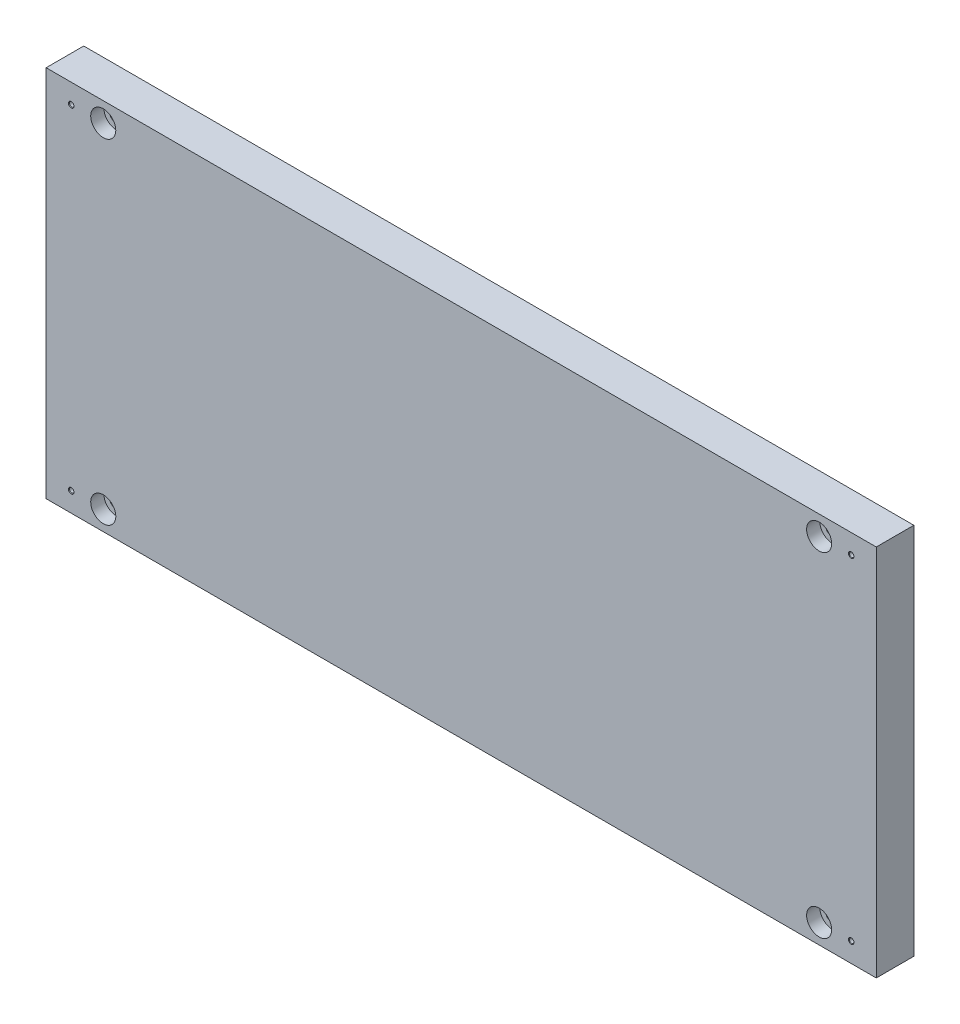
ISO-10303-21;
HEADER;
FILE_DESCRIPTION(('STEP AP214'),'2;1');
FILE_NAME('part.step','',(''),(''),'','','');
FILE_SCHEMA(('AUTOMOTIVE_DESIGN { 1 0 10303 214 1 1 1 1 }'));
ENDSEC;
DATA;
#1=APPLICATION_CONTEXT('core data for automotive mechanical design processes');
#2=APPLICATION_PROTOCOL_DEFINITION('international standard','automotive_design',2000,#1);
#3=PRODUCT_CONTEXT('',#1,'mechanical');
#4=PRODUCT('Part','Part','',(#3));
#5=PRODUCT_RELATED_PRODUCT_CATEGORY('part','',(#4));
#6=PRODUCT_DEFINITION_FORMATION('','',#4);
#7=PRODUCT_DEFINITION_CONTEXT('part definition',#1,'design');
#8=PRODUCT_DEFINITION('design','',#6,#7);
#9=PRODUCT_DEFINITION_SHAPE('','',#8);
#10=(LENGTH_UNIT() NAMED_UNIT(*) SI_UNIT(.MILLI.,.METRE.));
#11=(NAMED_UNIT(*) PLANE_ANGLE_UNIT() SI_UNIT($,.RADIAN.));
#12=(NAMED_UNIT(*) SI_UNIT($,.STERADIAN.) SOLID_ANGLE_UNIT());
#13=UNCERTAINTY_MEASURE_WITH_UNIT(LENGTH_MEASURE(1.E-05),#10,'distance_accuracy_value','');
#14=(GEOMETRIC_REPRESENTATION_CONTEXT(3) GLOBAL_UNCERTAINTY_ASSIGNED_CONTEXT((#13)) GLOBAL_UNIT_ASSIGNED_CONTEXT((#10,
#11,#12)) REPRESENTATION_CONTEXT('',''));
#15=CARTESIAN_POINT('',(0.,0.,0.));
#16=DIRECTION('',(0.,0.,1.));
#17=DIRECTION('',(1.,0.,0.));
#18=AXIS2_PLACEMENT_3D('',#15,#16,#17);
#19=CARTESIAN_POINT('',(0.,0.,27.));
#20=DIRECTION('',(0.,0.,1.));
#21=DIRECTION('',(1.,0.,0.));
#22=AXIS2_PLACEMENT_3D('',#19,#20,#21);
#23=PLANE('',#22);
#24=CARTESIAN_POINT('',(280.,120.,27.));
#25=DIRECTION('',(0.,0.,1.));
#26=DIRECTION('',(1.,0.,0.));
#27=AXIS2_PLACEMENT_3D('',#24,#25,#26);
#28=CIRCLE('',#27,2.);
#29=CARTESIAN_POINT('',(282.,120.,27.));
#30=VERTEX_POINT('',#29);
#31=EDGE_CURVE('E123',#30,#30,#28,.T.);
#32=ORIENTED_EDGE('',*,*,#31,.F.);
#33=EDGE_LOOP('',(#32));
#34=FACE_BOUND('',#33,.T.);
#35=CARTESIAN_POINT('',(-280.,120.,27.));
#36=DIRECTION('',(0.,0.,1.));
#37=DIRECTION('',(1.,0.,0.));
#38=AXIS2_PLACEMENT_3D('',#35,#36,#37);
#39=CIRCLE('',#38,2.);
#40=CARTESIAN_POINT('',(-278.,120.,27.));
#41=VERTEX_POINT('',#40);
#42=EDGE_CURVE('E141',#41,#41,#39,.T.);
#43=ORIENTED_EDGE('',*,*,#42,.F.);
#44=EDGE_LOOP('',(#43));
#45=FACE_BOUND('',#44,.T.);
#46=CARTESIAN_POINT('',(-257.,-120.,27.));
#47=DIRECTION('',(0.,0.,-1.));
#48=DIRECTION('',(-1.,0.,0.));
#49=AXIS2_PLACEMENT_3D('',#46,#47,#48);
#50=CIRCLE('',#49,9.00000000000001);
#51=CARTESIAN_POINT('',(-266.,-120.,27.));
#52=VERTEX_POINT('',#51);
#53=EDGE_CURVE('E153',#52,#52,#50,.T.);
#54=ORIENTED_EDGE('',*,*,#53,.T.);
#55=EDGE_LOOP('',(#54));
#56=FACE_BOUND('',#55,.T.);
#57=CARTESIAN_POINT('',(-257.,120.,27.));
#58=DIRECTION('',(0.,0.,1.));
#59=DIRECTION('',(1.,0.,0.));
#60=AXIS2_PLACEMENT_3D('',#57,#58,#59);
#61=CIRCLE('',#60,9.00000000000001);
#62=CARTESIAN_POINT('',(-248.,120.,27.));
#63=VERTEX_POINT('',#62);
#64=EDGE_CURVE('E174',#63,#63,#61,.T.);
#65=ORIENTED_EDGE('',*,*,#64,.F.);
#66=EDGE_LOOP('',(#65));
#67=FACE_BOUND('',#66,.T.);
#68=DIRECTION('',(0.,-1.,0.));
#69=VECTOR('',#68,1.);
#70=CARTESIAN_POINT('',(-298.,134.,27.));
#71=LINE('',#70,#69);
#72=CARTESIAN_POINT('',(-298.,134.,27.));
#73=VERTEX_POINT('',#72);
#74=CARTESIAN_POINT('',(-298.,-134.,27.));
#75=VERTEX_POINT('',#74);
#76=EDGE_CURVE('E193',#73,#75,#71,.T.);
#77=ORIENTED_EDGE('',*,*,#76,.T.);
#78=DIRECTION('',(1.,0.,0.));
#79=VECTOR('',#78,1.);
#80=CARTESIAN_POINT('',(-298.,-134.,27.));
#81=LINE('',#80,#79);
#82=CARTESIAN_POINT('',(298.,-134.,27.));
#83=VERTEX_POINT('',#82);
#84=EDGE_CURVE('E87',#75,#83,#81,.T.);
#85=ORIENTED_EDGE('',*,*,#84,.T.);
#86=DIRECTION('',(0.,1.,0.));
#87=VECTOR('',#86,1.);
#88=CARTESIAN_POINT('',(298.,-134.,27.));
#89=LINE('',#88,#87);
#90=CARTESIAN_POINT('',(298.,134.,27.));
#91=VERTEX_POINT('',#90);
#92=EDGE_CURVE('E196',#83,#91,#89,.T.);
#93=ORIENTED_EDGE('',*,*,#92,.T.);
#94=DIRECTION('',(-1.,0.,0.));
#95=VECTOR('',#94,1.);
#96=CARTESIAN_POINT('',(298.,134.,27.));
#97=LINE('',#96,#95);
#98=EDGE_CURVE('E56',#91,#73,#97,.T.);
#99=ORIENTED_EDGE('',*,*,#98,.T.);
#100=EDGE_LOOP('',(#77,#85,#93,#99));
#101=FACE_BOUND('',#100,.T.);
#102=CARTESIAN_POINT('',(257.,120.,27.));
#103=DIRECTION('',(0.,0.,1.));
#104=DIRECTION('',(1.,0.,0.));
#105=AXIS2_PLACEMENT_3D('',#102,#103,#104);
#106=CIRCLE('',#105,9.00000000000001);
#107=CARTESIAN_POINT('',(266.,120.,27.));
#108=VERTEX_POINT('',#107);
#109=EDGE_CURVE('E165',#108,#108,#106,.T.);
#110=ORIENTED_EDGE('',*,*,#109,.F.);
#111=EDGE_LOOP('',(#110));
#112=FACE_BOUND('',#111,.T.);
#113=CARTESIAN_POINT('',(257.,-120.,27.));
#114=DIRECTION('',(0.,0.,-1.));
#115=DIRECTION('',(-1.,0.,0.));
#116=AXIS2_PLACEMENT_3D('',#113,#114,#115);
#117=CIRCLE('',#116,9.00000000000001);
#118=CARTESIAN_POINT('',(248.,-120.,27.));
#119=VERTEX_POINT('',#118);
#120=EDGE_CURVE('E144',#119,#119,#117,.T.);
#121=ORIENTED_EDGE('',*,*,#120,.T.);
#122=EDGE_LOOP('',(#121));
#123=FACE_BOUND('',#122,.T.);
#124=CARTESIAN_POINT('',(-280.,-120.,27.));
#125=DIRECTION('',(0.,0.,-1.));
#126=DIRECTION('',(-1.,0.,0.));
#127=AXIS2_PLACEMENT_3D('',#124,#125,#126);
#128=CIRCLE('',#127,2.);
#129=CARTESIAN_POINT('',(-282.,-120.,27.));
#130=VERTEX_POINT('',#129);
#131=EDGE_CURVE('E132',#130,#130,#128,.T.);
#132=ORIENTED_EDGE('',*,*,#131,.T.);
#133=EDGE_LOOP('',(#132));
#134=FACE_BOUND('',#133,.T.);
#135=CARTESIAN_POINT('',(280.,-120.,27.));
#136=DIRECTION('',(0.,0.,-1.));
#137=DIRECTION('',(-1.,0.,0.));
#138=AXIS2_PLACEMENT_3D('',#135,#136,#137);
#139=CIRCLE('',#138,2.);
#140=CARTESIAN_POINT('',(278.,-120.,27.));
#141=VERTEX_POINT('',#140);
#142=EDGE_CURVE('E112',#141,#141,#139,.T.);
#143=ORIENTED_EDGE('',*,*,#142,.T.);
#144=EDGE_LOOP('',(#143));
#145=FACE_BOUND('',#144,.T.);
#146=ADVANCED_FACE('F39',(#34,#45,#56,#67,#101,#112,#123,#134,#145),#23,.T.);
#147=CARTESIAN_POINT('',(0.,0.,0.));
#148=DIRECTION('',(0.,0.,1.));
#149=DIRECTION('',(1.,0.,0.));
#150=AXIS2_PLACEMENT_3D('',#147,#148,#149);
#151=PLANE('',#150);
#152=CARTESIAN_POINT('',(-257.,120.,0.));
#153=DIRECTION('',(0.,0.,1.));
#154=DIRECTION('',(1.,0.,0.));
#155=AXIS2_PLACEMENT_3D('',#152,#153,#154);
#156=CIRCLE('',#155,5.);
#157=CARTESIAN_POINT('',(-252.,120.,0.));
#158=VERTEX_POINT('',#157);
#159=EDGE_CURVE('E183',#158,#158,#156,.T.);
#160=ORIENTED_EDGE('',*,*,#159,.T.);
#161=EDGE_LOOP('',(#160));
#162=FACE_BOUND('',#161,.T.);
#163=CARTESIAN_POINT('',(257.,120.,0.));
#164=DIRECTION('',(0.,0.,1.));
#165=DIRECTION('',(1.,0.,0.));
#166=AXIS2_PLACEMENT_3D('',#163,#164,#165);
#167=CIRCLE('',#166,5.);
#168=CARTESIAN_POINT('',(262.,120.,0.));
#169=VERTEX_POINT('',#168);
#170=EDGE_CURVE('E189',#169,#169,#167,.T.);
#171=ORIENTED_EDGE('',*,*,#170,.T.);
#172=EDGE_LOOP('',(#171));
#173=FACE_BOUND('',#172,.T.);
#174=DIRECTION('',(0.,-1.,0.));
#175=VECTOR('',#174,1.);
#176=CARTESIAN_POINT('',(-298.,134.,0.));
#177=LINE('',#176,#175);
#178=CARTESIAN_POINT('',(-298.,134.,0.));
#179=VERTEX_POINT('',#178);
#180=CARTESIAN_POINT('',(-298.,-134.,0.));
#181=VERTEX_POINT('',#180);
#182=EDGE_CURVE('E192',#179,#181,#177,.T.);
#183=ORIENTED_EDGE('',*,*,#182,.F.);
#184=DIRECTION('',(-1.,0.,0.));
#185=VECTOR('',#184,1.);
#186=CARTESIAN_POINT('',(298.,134.,0.));
#187=LINE('',#186,#185);
#188=CARTESIAN_POINT('',(298.,134.,0.));
#189=VERTEX_POINT('',#188);
#190=EDGE_CURVE('E80',#189,#179,#187,.T.);
#191=ORIENTED_EDGE('',*,*,#190,.F.);
#192=DIRECTION('',(0.,1.,0.));
#193=VECTOR('',#192,1.);
#194=CARTESIAN_POINT('',(298.,-134.,0.));
#195=LINE('',#194,#193);
#196=CARTESIAN_POINT('',(298.,-134.,0.));
#197=VERTEX_POINT('',#196);
#198=EDGE_CURVE('E74',#197,#189,#195,.T.);
#199=ORIENTED_EDGE('',*,*,#198,.F.);
#200=DIRECTION('',(1.,0.,0.));
#201=VECTOR('',#200,1.);
#202=CARTESIAN_POINT('',(-298.,-134.,0.));
#203=LINE('',#202,#201);
#204=EDGE_CURVE('E202',#181,#197,#203,.T.);
#205=ORIENTED_EDGE('',*,*,#204,.F.);
#206=EDGE_LOOP('',(#183,#191,#199,#205));
#207=FACE_BOUND('',#206,.T.);
#208=CARTESIAN_POINT('',(257.,-120.,0.));
#209=DIRECTION('',(0.,0.,-1.));
#210=DIRECTION('',(-1.,0.,0.));
#211=AXIS2_PLACEMENT_3D('',#208,#209,#210);
#212=CIRCLE('',#211,5.);
#213=CARTESIAN_POINT('',(252.,-120.,0.));
#214=VERTEX_POINT('',#213);
#215=EDGE_CURVE('E186',#214,#214,#212,.T.);
#216=ORIENTED_EDGE('',*,*,#215,.F.);
#217=EDGE_LOOP('',(#216));
#218=FACE_BOUND('',#217,.T.);
#219=CARTESIAN_POINT('',(-257.,-120.,0.));
#220=DIRECTION('',(0.,0.,-1.));
#221=DIRECTION('',(-1.,0.,0.));
#222=AXIS2_PLACEMENT_3D('',#219,#220,#221);
#223=CIRCLE('',#222,5.);
#224=CARTESIAN_POINT('',(-262.,-120.,0.));
#225=VERTEX_POINT('',#224);
#226=EDGE_CURVE('E180',#225,#225,#223,.T.);
#227=ORIENTED_EDGE('',*,*,#226,.F.);
#228=EDGE_LOOP('',(#227));
#229=FACE_BOUND('',#228,.T.);
#230=ADVANCED_FACE('F212',(#162,#173,#207,#218,#229),#151,.F.);
#231=CARTESIAN_POINT('',(-298.,134.,27.));
#232=DIRECTION('',(1.,0.,0.));
#233=DIRECTION('',(0.,0.,-1.));
#234=AXIS2_PLACEMENT_3D('',#231,#232,#233);
#235=PLANE('',#234);
#236=ORIENTED_EDGE('',*,*,#182,.T.);
#237=DIRECTION('',(0.,0.,-1.));
#238=VECTOR('',#237,1.);
#239=CARTESIAN_POINT('',(-298.,-134.,27.));
#240=LINE('',#239,#238);
#241=EDGE_CURVE('E11',#75,#181,#240,.T.);
#242=ORIENTED_EDGE('',*,*,#241,.F.);
#243=ORIENTED_EDGE('',*,*,#76,.F.);
#244=DIRECTION('',(0.,0.,-1.));
#245=VECTOR('',#244,1.);
#246=CARTESIAN_POINT('',(-298.,134.,27.));
#247=LINE('',#246,#245);
#248=EDGE_CURVE('E199',#73,#179,#247,.T.);
#249=ORIENTED_EDGE('',*,*,#248,.T.);
#250=EDGE_LOOP('',(#236,#242,#243,#249));
#251=FACE_BOUND('',#250,.T.);
#252=ADVANCED_FACE('F41',(#251),#235,.F.);
#253=CARTESIAN_POINT('',(-298.,-134.,27.));
#254=DIRECTION('',(0.,1.,0.));
#255=DIRECTION('',(0.,0.,1.));
#256=AXIS2_PLACEMENT_3D('',#253,#254,#255);
#257=PLANE('',#256);
#258=ORIENTED_EDGE('',*,*,#204,.T.);
#259=DIRECTION('',(0.,0.,-1.));
#260=VECTOR('',#259,1.);
#261=CARTESIAN_POINT('',(298.,-134.,27.));
#262=LINE('',#261,#260);
#263=EDGE_CURVE('E48',#83,#197,#262,.T.);
#264=ORIENTED_EDGE('',*,*,#263,.F.);
#265=ORIENTED_EDGE('',*,*,#84,.F.);
#266=ORIENTED_EDGE('',*,*,#241,.T.);
#267=EDGE_LOOP('',(#258,#264,#265,#266));
#268=FACE_BOUND('',#267,.T.);
#269=ADVANCED_FACE('F228',(#268),#257,.F.);
#270=CARTESIAN_POINT('',(298.,-134.,27.));
#271=DIRECTION('',(-1.,0.,0.));
#272=DIRECTION('',(0.,0.,1.));
#273=AXIS2_PLACEMENT_3D('',#270,#271,#272);
#274=PLANE('',#273);
#275=ORIENTED_EDGE('',*,*,#198,.T.);
#276=DIRECTION('',(0.,0.,-1.));
#277=VECTOR('',#276,1.);
#278=CARTESIAN_POINT('',(298.,134.,27.));
#279=LINE('',#278,#277);
#280=EDGE_CURVE('E207',#91,#189,#279,.T.);
#281=ORIENTED_EDGE('',*,*,#280,.F.);
#282=ORIENTED_EDGE('',*,*,#92,.F.);
#283=ORIENTED_EDGE('',*,*,#263,.T.);
#284=EDGE_LOOP('',(#275,#281,#282,#283));
#285=FACE_BOUND('',#284,.T.);
#286=ADVANCED_FACE('F209',(#285),#274,.F.);
#287=CARTESIAN_POINT('',(298.,134.,27.));
#288=DIRECTION('',(0.,-1.,0.));
#289=DIRECTION('',(0.,0.,-1.));
#290=AXIS2_PLACEMENT_3D('',#287,#288,#289);
#291=PLANE('',#290);
#292=ORIENTED_EDGE('',*,*,#190,.T.);
#293=ORIENTED_EDGE('',*,*,#248,.F.);
#294=ORIENTED_EDGE('',*,*,#98,.F.);
#295=ORIENTED_EDGE('',*,*,#280,.T.);
#296=EDGE_LOOP('',(#292,#293,#294,#295));
#297=FACE_BOUND('',#296,.T.);
#298=ADVANCED_FACE('F217',(#297),#291,.F.);
#299=CARTESIAN_POINT('',(257.,120.,0.));
#300=DIRECTION('',(0.,0.,1.));
#301=DIRECTION('',(1.,0.,0.));
#302=AXIS2_PLACEMENT_3D('',#299,#300,#301);
#303=CYLINDRICAL_SURFACE('',#302,5.);
#304=CARTESIAN_POINT('',(257.,120.,17.5));
#305=DIRECTION('',(0.,0.,1.));
#306=DIRECTION('',(1.,0.,0.));
#307=AXIS2_PLACEMENT_3D('',#304,#305,#306);
#308=CIRCLE('',#307,5.);
#309=CARTESIAN_POINT('',(262.,120.,17.5));
#310=VERTEX_POINT('',#309);
#311=EDGE_CURVE('E168',#310,#310,#308,.T.);
#312=ORIENTED_EDGE('',*,*,#311,.T.);
#313=EDGE_LOOP('',(#312));
#314=FACE_BOUND('',#313,.T.);
#315=ORIENTED_EDGE('',*,*,#170,.F.);
#316=EDGE_LOOP('',(#315));
#317=FACE_BOUND('',#316,.T.);
#318=ADVANCED_FACE('F219',(#314,#317),#303,.F.);
#319=CARTESIAN_POINT('',(257.,-120.,17.5));
#320=DIRECTION('',(0.,0.,-1.));
#321=DIRECTION('',(-1.,0.,0.));
#322=AXIS2_PLACEMENT_3D('',#319,#320,#321);
#323=CYLINDRICAL_SURFACE('',#322,5.);
#324=ORIENTED_EDGE('',*,*,#215,.T.);
#325=EDGE_LOOP('',(#324));
#326=FACE_BOUND('',#325,.T.);
#327=CARTESIAN_POINT('',(257.,-120.,17.5));
#328=DIRECTION('',(0.,0.,1.));
#329=DIRECTION('',(1.,0.,0.));
#330=AXIS2_PLACEMENT_3D('',#327,#328,#329);
#331=CIRCLE('',#330,5.);
#332=CARTESIAN_POINT('',(262.,-120.,17.5));
#333=VERTEX_POINT('',#332);
#334=EDGE_CURVE('E150',#333,#333,#331,.T.);
#335=ORIENTED_EDGE('',*,*,#334,.T.);
#336=EDGE_LOOP('',(#335));
#337=FACE_BOUND('',#336,.T.);
#338=ADVANCED_FACE('F225',(#326,#337),#323,.F.);
#339=CARTESIAN_POINT('',(-257.,120.,0.));
#340=DIRECTION('',(0.,0.,1.));
#341=DIRECTION('',(1.,0.,0.));
#342=AXIS2_PLACEMENT_3D('',#339,#340,#341);
#343=CYLINDRICAL_SURFACE('',#342,5.);
#344=CARTESIAN_POINT('',(-257.,120.,17.5));
#345=DIRECTION('',(0.,0.,1.));
#346=DIRECTION('',(1.,0.,0.));
#347=AXIS2_PLACEMENT_3D('',#344,#345,#346);
#348=CIRCLE('',#347,5.);
#349=CARTESIAN_POINT('',(-252.,120.,17.5));
#350=VERTEX_POINT('',#349);
#351=EDGE_CURVE('E177',#350,#350,#348,.T.);
#352=ORIENTED_EDGE('',*,*,#351,.T.);
#353=EDGE_LOOP('',(#352));
#354=FACE_BOUND('',#353,.T.);
#355=ORIENTED_EDGE('',*,*,#159,.F.);
#356=EDGE_LOOP('',(#355));
#357=FACE_BOUND('',#356,.T.);
#358=ADVANCED_FACE('F243',(#354,#357),#343,.F.);
#359=CARTESIAN_POINT('',(-257.,-120.,17.5));
#360=DIRECTION('',(0.,0.,-1.));
#361=DIRECTION('',(-1.,0.,0.));
#362=AXIS2_PLACEMENT_3D('',#359,#360,#361);
#363=CYLINDRICAL_SURFACE('',#362,5.);
#364=ORIENTED_EDGE('',*,*,#226,.T.);
#365=EDGE_LOOP('',(#364));
#366=FACE_BOUND('',#365,.T.);
#367=CARTESIAN_POINT('',(-257.,-120.,17.5));
#368=DIRECTION('',(0.,0.,1.));
#369=DIRECTION('',(1.,0.,0.));
#370=AXIS2_PLACEMENT_3D('',#367,#368,#369);
#371=CIRCLE('',#370,5.);
#372=CARTESIAN_POINT('',(-252.,-120.,17.5));
#373=VERTEX_POINT('',#372);
#374=EDGE_CURVE('E159',#373,#373,#371,.T.);
#375=ORIENTED_EDGE('',*,*,#374,.T.);
#376=EDGE_LOOP('',(#375));
#377=FACE_BOUND('',#376,.T.);
#378=ADVANCED_FACE('F247',(#366,#377),#363,.F.);
#379=CARTESIAN_POINT('',(-257.,120.,17.5));
#380=DIRECTION('',(0.,0.,1.));
#381=DIRECTION('',(1.,0.,0.));
#382=AXIS2_PLACEMENT_3D('',#379,#380,#381);
#383=CYLINDRICAL_SURFACE('',#382,9.00000000000001);
#384=ORIENTED_EDGE('',*,*,#64,.T.);
#385=EDGE_LOOP('',(#384));
#386=FACE_BOUND('',#385,.T.);
#387=CARTESIAN_POINT('',(-257.,120.,17.5));
#388=DIRECTION('',(0.,0.,1.));
#389=DIRECTION('',(1.,0.,0.));
#390=AXIS2_PLACEMENT_3D('',#387,#388,#389);
#391=CIRCLE('',#390,9.00000000000001);
#392=CARTESIAN_POINT('',(-248.,120.,17.5));
#393=VERTEX_POINT('',#392);
#394=EDGE_CURVE('E171',#393,#393,#391,.T.);
#395=ORIENTED_EDGE('',*,*,#394,.F.);
#396=EDGE_LOOP('',(#395));
#397=FACE_BOUND('',#396,.T.);
#398=ADVANCED_FACE('F251',(#386,#397),#383,.F.);
#399=CARTESIAN_POINT('',(-257.,129.,17.5));
#400=DIRECTION('',(0.,0.,1.));
#401=DIRECTION('',(1.,0.,0.));
#402=AXIS2_PLACEMENT_3D('',#399,#400,#401);
#403=PLANE('',#402);
#404=ORIENTED_EDGE('',*,*,#351,.F.);
#405=EDGE_LOOP('',(#404));
#406=FACE_BOUND('',#405,.T.);
#407=ORIENTED_EDGE('',*,*,#394,.T.);
#408=EDGE_LOOP('',(#407));
#409=FACE_BOUND('',#408,.T.);
#410=ADVANCED_FACE('F255',(#406,#409),#403,.T.);
#411=CARTESIAN_POINT('',(257.,120.,17.5));
#412=DIRECTION('',(0.,0.,1.));
#413=DIRECTION('',(1.,0.,0.));
#414=AXIS2_PLACEMENT_3D('',#411,#412,#413);
#415=CYLINDRICAL_SURFACE('',#414,9.00000000000001);
#416=ORIENTED_EDGE('',*,*,#109,.T.);
#417=EDGE_LOOP('',(#416));
#418=FACE_BOUND('',#417,.T.);
#419=CARTESIAN_POINT('',(257.,120.,17.5));
#420=DIRECTION('',(0.,0.,1.));
#421=DIRECTION('',(1.,0.,0.));
#422=AXIS2_PLACEMENT_3D('',#419,#420,#421);
#423=CIRCLE('',#422,9.00000000000001);
#424=CARTESIAN_POINT('',(266.,120.,17.5));
#425=VERTEX_POINT('',#424);
#426=EDGE_CURVE('E162',#425,#425,#423,.T.);
#427=ORIENTED_EDGE('',*,*,#426,.F.);
#428=EDGE_LOOP('',(#427));
#429=FACE_BOUND('',#428,.T.);
#430=ADVANCED_FACE('F259',(#418,#429),#415,.F.);
#431=CARTESIAN_POINT('',(257.,129.,17.5));
#432=DIRECTION('',(0.,0.,1.));
#433=DIRECTION('',(1.,0.,0.));
#434=AXIS2_PLACEMENT_3D('',#431,#432,#433);
#435=PLANE('',#434);
#436=ORIENTED_EDGE('',*,*,#311,.F.);
#437=EDGE_LOOP('',(#436));
#438=FACE_BOUND('',#437,.T.);
#439=ORIENTED_EDGE('',*,*,#426,.T.);
#440=EDGE_LOOP('',(#439));
#441=FACE_BOUND('',#440,.T.);
#442=ADVANCED_FACE('F263',(#438,#441),#435,.T.);
#443=CARTESIAN_POINT('',(-257.,-120.,17.5));
#444=DIRECTION('',(0.,0.,1.));
#445=DIRECTION('',(1.,0.,0.));
#446=AXIS2_PLACEMENT_3D('',#443,#444,#445);
#447=PLANE('',#446);
#448=ORIENTED_EDGE('',*,*,#374,.F.);
#449=EDGE_LOOP('',(#448));
#450=FACE_BOUND('',#449,.T.);
#451=CARTESIAN_POINT('',(-257.,-120.,17.5));
#452=DIRECTION('',(0.,0.,-1.));
#453=DIRECTION('',(-1.,0.,0.));
#454=AXIS2_PLACEMENT_3D('',#451,#452,#453);
#455=CIRCLE('',#454,9.00000000000001);
#456=CARTESIAN_POINT('',(-266.,-120.,17.5));
#457=VERTEX_POINT('',#456);
#458=EDGE_CURVE('E156',#457,#457,#455,.T.);
#459=ORIENTED_EDGE('',*,*,#458,.F.);
#460=EDGE_LOOP('',(#459));
#461=FACE_BOUND('',#460,.T.);
#462=ADVANCED_FACE('F267',(#450,#461),#447,.T.);
#463=CARTESIAN_POINT('',(-257.,-120.,27.));
#464=DIRECTION('',(0.,0.,-1.));
#465=DIRECTION('',(-1.,0.,0.));
#466=AXIS2_PLACEMENT_3D('',#463,#464,#465);
#467=CYLINDRICAL_SURFACE('',#466,9.00000000000001);
#468=ORIENTED_EDGE('',*,*,#458,.T.);
#469=EDGE_LOOP('',(#468));
#470=FACE_BOUND('',#469,.T.);
#471=ORIENTED_EDGE('',*,*,#53,.F.);
#472=EDGE_LOOP('',(#471));
#473=FACE_BOUND('',#472,.T.);
#474=ADVANCED_FACE('F271',(#470,#473),#467,.F.);
#475=CARTESIAN_POINT('',(257.,-120.,17.5));
#476=DIRECTION('',(0.,0.,1.));
#477=DIRECTION('',(1.,0.,0.));
#478=AXIS2_PLACEMENT_3D('',#475,#476,#477);
#479=PLANE('',#478);
#480=ORIENTED_EDGE('',*,*,#334,.F.);
#481=EDGE_LOOP('',(#480));
#482=FACE_BOUND('',#481,.T.);
#483=CARTESIAN_POINT('',(257.,-120.,17.5));
#484=DIRECTION('',(0.,0.,-1.));
#485=DIRECTION('',(-1.,0.,0.));
#486=AXIS2_PLACEMENT_3D('',#483,#484,#485);
#487=CIRCLE('',#486,9.00000000000001);
#488=CARTESIAN_POINT('',(248.,-120.,17.5));
#489=VERTEX_POINT('',#488);
#490=EDGE_CURVE('E147',#489,#489,#487,.T.);
#491=ORIENTED_EDGE('',*,*,#490,.F.);
#492=EDGE_LOOP('',(#491));
#493=FACE_BOUND('',#492,.T.);
#494=ADVANCED_FACE('F275',(#482,#493),#479,.T.);
#495=CARTESIAN_POINT('',(257.,-120.,27.));
#496=DIRECTION('',(0.,0.,-1.));
#497=DIRECTION('',(-1.,0.,0.));
#498=AXIS2_PLACEMENT_3D('',#495,#496,#497);
#499=CYLINDRICAL_SURFACE('',#498,9.00000000000001);
#500=ORIENTED_EDGE('',*,*,#490,.T.);
#501=EDGE_LOOP('',(#500));
#502=FACE_BOUND('',#501,.T.);
#503=ORIENTED_EDGE('',*,*,#120,.F.);
#504=EDGE_LOOP('',(#503));
#505=FACE_BOUND('',#504,.T.);
#506=ADVANCED_FACE('F279',(#502,#505),#499,.F.);
#507=CARTESIAN_POINT('',(-280.,120.,26.621));
#508=DIRECTION('',(0.,0.,1.));
#509=DIRECTION('',(1.,0.,0.));
#510=AXIS2_PLACEMENT_3D('',#507,#508,#509);
#511=CONICAL_SURFACE('',#510,1.621,0.785398163397448);
#512=ORIENTED_EDGE('',*,*,#42,.T.);
#513=EDGE_LOOP('',(#512));
#514=FACE_BOUND('',#513,.T.);
#515=CARTESIAN_POINT('',(-280.,120.,26.621));
#516=DIRECTION('',(0.,0.,1.));
#517=DIRECTION('',(1.,0.,0.));
#518=AXIS2_PLACEMENT_3D('',#515,#516,#517);
#519=CIRCLE('',#518,1.621);
#520=CARTESIAN_POINT('',(-278.379,120.,26.621));
#521=VERTEX_POINT('',#520);
#522=EDGE_CURVE('E138',#521,#521,#519,.T.);
#523=ORIENTED_EDGE('',*,*,#522,.F.);
#524=EDGE_LOOP('',(#523));
#525=FACE_BOUND('',#524,.T.);
#526=ADVANCED_FACE('F283',(#514,#525),#511,.F.);
#527=CARTESIAN_POINT('',(-280.,120.,16.3452994616207));
#528=DIRECTION('',(0.,0.,1.));
#529=DIRECTION('',(1.,0.,0.));
#530=AXIS2_PLACEMENT_3D('',#527,#528,#529);
#531=CYLINDRICAL_SURFACE('',#530,1.621);
#532=ORIENTED_EDGE('',*,*,#522,.T.);
#533=EDGE_LOOP('',(#532));
#534=FACE_BOUND('',#533,.T.);
#535=CARTESIAN_POINT('',(-280.,120.,17.2811842479771));
#536=DIRECTION('',(0.,0.,1.));
#537=DIRECTION('',(1.,0.,0.));
#538=AXIS2_PLACEMENT_3D('',#535,#536,#537);
#539=CIRCLE('',#538,1.621);
#540=CARTESIAN_POINT('',(-278.379,120.,17.2811842479771));
#541=VERTEX_POINT('',#540);
#542=EDGE_CURVE('E135',#541,#541,#539,.T.);
#543=ORIENTED_EDGE('',*,*,#542,.F.);
#544=EDGE_LOOP('',(#543));
#545=FACE_BOUND('',#544,.T.);
#546=ADVANCED_FACE('F287',(#534,#545),#531,.F.);
#547=CARTESIAN_POINT('',(-280.,120.,16.3452994616207));
#548=DIRECTION('',(0.,0.,1.));
#549=DIRECTION('',(1.,0.,0.));
#550=AXIS2_PLACEMENT_3D('',#547,#548,#549);
#551=CONICAL_SURFACE('',#550,0.,1.0471975511966);
#552=ORIENTED_EDGE('',*,*,#542,.T.);
#553=EDGE_LOOP('',(#552));
#554=FACE_BOUND('',#553,.T.);
#555=CARTESIAN_POINT('',(-280.,120.,16.3452994616207));
#556=VERTEX_POINT('',#555);
#557=VERTEX_LOOP('',#556);
#558=FACE_BOUND('',#557,.T.);
#559=ADVANCED_FACE('F291',(#554,#558),#551,.F.);
#560=CARTESIAN_POINT('',(-280.,-120.,27.));
#561=DIRECTION('',(0.,0.,1.));
#562=DIRECTION('',(1.,0.,0.));
#563=AXIS2_PLACEMENT_3D('',#560,#561,#562);
#564=CONICAL_SURFACE('',#563,2.,0.785398163397448);
#565=CARTESIAN_POINT('',(-280.,-120.,26.621));
#566=DIRECTION('',(0.,0.,-1.));
#567=DIRECTION('',(-1.,0.,0.));
#568=AXIS2_PLACEMENT_3D('',#565,#566,#567);
#569=CIRCLE('',#568,1.621);
#570=CARTESIAN_POINT('',(-281.621,-120.,26.621));
#571=VERTEX_POINT('',#570);
#572=EDGE_CURVE('E129',#571,#571,#569,.T.);
#573=ORIENTED_EDGE('',*,*,#572,.T.);
#574=EDGE_LOOP('',(#573));
#575=FACE_BOUND('',#574,.T.);
#576=ORIENTED_EDGE('',*,*,#131,.F.);
#577=EDGE_LOOP('',(#576));
#578=FACE_BOUND('',#577,.T.);
#579=ADVANCED_FACE('F295',(#575,#578),#564,.F.);
#580=CARTESIAN_POINT('',(-280.,-120.,27.));
#581=DIRECTION('',(0.,0.,-1.));
#582=DIRECTION('',(-1.,0.,0.));
#583=AXIS2_PLACEMENT_3D('',#580,#581,#582);
#584=CYLINDRICAL_SURFACE('',#583,1.621);
#585=CARTESIAN_POINT('',(-280.,-120.,17.2811842479771));
#586=DIRECTION('',(0.,0.,-1.));
#587=DIRECTION('',(-1.,0.,0.));
#588=AXIS2_PLACEMENT_3D('',#585,#586,#587);
#589=CIRCLE('',#588,1.621);
#590=CARTESIAN_POINT('',(-281.621,-120.,17.2811842479771));
#591=VERTEX_POINT('',#590);
#592=EDGE_CURVE('E126',#591,#591,#589,.T.);
#593=ORIENTED_EDGE('',*,*,#592,.T.);
#594=EDGE_LOOP('',(#593));
#595=FACE_BOUND('',#594,.T.);
#596=ORIENTED_EDGE('',*,*,#572,.F.);
#597=EDGE_LOOP('',(#596));
#598=FACE_BOUND('',#597,.T.);
#599=ADVANCED_FACE('F299',(#595,#598),#584,.F.);
#600=CARTESIAN_POINT('',(-280.,-120.,17.2811842479771));
#601=DIRECTION('',(0.,0.,1.));
#602=DIRECTION('',(1.,0.,0.));
#603=AXIS2_PLACEMENT_3D('',#600,#601,#602);
#604=CONICAL_SURFACE('',#603,1.621,1.0471975511966);
#605=CARTESIAN_POINT('',(-280.,-120.,16.3452994616207));
#606=VERTEX_POINT('',#605);
#607=VERTEX_LOOP('',#606);
#608=FACE_BOUND('',#607,.T.);
#609=ORIENTED_EDGE('',*,*,#592,.F.);
#610=EDGE_LOOP('',(#609));
#611=FACE_BOUND('',#610,.T.);
#612=ADVANCED_FACE('F303',(#608,#611),#604,.F.);
#613=CARTESIAN_POINT('',(280.,120.,26.621));
#614=DIRECTION('',(0.,0.,1.));
#615=DIRECTION('',(1.,0.,0.));
#616=AXIS2_PLACEMENT_3D('',#613,#614,#615);
#617=CONICAL_SURFACE('',#616,1.621,0.785398163397448);
#618=ORIENTED_EDGE('',*,*,#31,.T.);
#619=EDGE_LOOP('',(#618));
#620=FACE_BOUND('',#619,.T.);
#621=CARTESIAN_POINT('',(280.,120.,26.621));
#622=DIRECTION('',(0.,0.,1.));
#623=DIRECTION('',(1.,0.,0.));
#624=AXIS2_PLACEMENT_3D('',#621,#622,#623);
#625=CIRCLE('',#624,1.621);
#626=CARTESIAN_POINT('',(281.621,120.,26.621));
#627=VERTEX_POINT('',#626);
#628=EDGE_CURVE('E120',#627,#627,#625,.T.);
#629=ORIENTED_EDGE('',*,*,#628,.F.);
#630=EDGE_LOOP('',(#629));
#631=FACE_BOUND('',#630,.T.);
#632=ADVANCED_FACE('F307',(#620,#631),#617,.F.);
#633=CARTESIAN_POINT('',(280.,120.,16.3452994616207));
#634=DIRECTION('',(0.,0.,1.));
#635=DIRECTION('',(1.,0.,0.));
#636=AXIS2_PLACEMENT_3D('',#633,#634,#635);
#637=CYLINDRICAL_SURFACE('',#636,1.621);
#638=ORIENTED_EDGE('',*,*,#628,.T.);
#639=EDGE_LOOP('',(#638));
#640=FACE_BOUND('',#639,.T.);
#641=CARTESIAN_POINT('',(280.,120.,17.2811842479771));
#642=DIRECTION('',(0.,0.,1.));
#643=DIRECTION('',(1.,0.,0.));
#644=AXIS2_PLACEMENT_3D('',#641,#642,#643);
#645=CIRCLE('',#644,1.621);
#646=CARTESIAN_POINT('',(281.621,120.,17.2811842479771));
#647=VERTEX_POINT('',#646);
#648=EDGE_CURVE('E117',#647,#647,#645,.T.);
#649=ORIENTED_EDGE('',*,*,#648,.F.);
#650=EDGE_LOOP('',(#649));
#651=FACE_BOUND('',#650,.T.);
#652=ADVANCED_FACE('F311',(#640,#651),#637,.F.);
#653=CARTESIAN_POINT('',(280.,120.,16.3452994616207));
#654=DIRECTION('',(0.,0.,1.));
#655=DIRECTION('',(1.,0.,0.));
#656=AXIS2_PLACEMENT_3D('',#653,#654,#655);
#657=CONICAL_SURFACE('',#656,0.,1.0471975511966);
#658=ORIENTED_EDGE('',*,*,#648,.T.);
#659=EDGE_LOOP('',(#658));
#660=FACE_BOUND('',#659,.T.);
#661=CARTESIAN_POINT('',(280.,120.,16.3452994616207));
#662=VERTEX_POINT('',#661);
#663=VERTEX_LOOP('',#662);
#664=FACE_BOUND('',#663,.T.);
#665=ADVANCED_FACE('F315',(#660,#664),#657,.F.);
#666=CARTESIAN_POINT('',(280.,-120.,27.));
#667=DIRECTION('',(0.,0.,1.));
#668=DIRECTION('',(1.,0.,0.));
#669=AXIS2_PLACEMENT_3D('',#666,#667,#668);
#670=CONICAL_SURFACE('',#669,2.,0.785398163397448);
#671=CARTESIAN_POINT('',(280.,-120.,26.621));
#672=DIRECTION('',(0.,0.,-1.));
#673=DIRECTION('',(-1.,0.,0.));
#674=AXIS2_PLACEMENT_3D('',#671,#672,#673);
#675=CIRCLE('',#674,1.621);
#676=CARTESIAN_POINT('',(278.379,-120.,26.621));
#677=VERTEX_POINT('',#676);
#678=EDGE_CURVE('E109',#677,#677,#675,.T.);
#679=ORIENTED_EDGE('',*,*,#678,.T.);
#680=EDGE_LOOP('',(#679));
#681=FACE_BOUND('',#680,.T.);
#682=ORIENTED_EDGE('',*,*,#142,.F.);
#683=EDGE_LOOP('',(#682));
#684=FACE_BOUND('',#683,.T.);
#685=ADVANCED_FACE('F319',(#681,#684),#670,.F.);
#686=CARTESIAN_POINT('',(280.,-120.,27.));
#687=DIRECTION('',(0.,0.,-1.));
#688=DIRECTION('',(-1.,0.,0.));
#689=AXIS2_PLACEMENT_3D('',#686,#687,#688);
#690=CYLINDRICAL_SURFACE('',#689,1.621);
#691=CARTESIAN_POINT('',(280.,-120.,17.2811842479771));
#692=DIRECTION('',(0.,0.,-1.));
#693=DIRECTION('',(-1.,0.,0.));
#694=AXIS2_PLACEMENT_3D('',#691,#692,#693);
#695=CIRCLE('',#694,1.621);
#696=CARTESIAN_POINT('',(278.379,-120.,17.2811842479771));
#697=VERTEX_POINT('',#696);
#698=EDGE_CURVE('E107',#697,#697,#695,.T.);
#699=ORIENTED_EDGE('',*,*,#698,.T.);
#700=EDGE_LOOP('',(#699));
#701=FACE_BOUND('',#700,.T.);
#702=ORIENTED_EDGE('',*,*,#678,.F.);
#703=EDGE_LOOP('',(#702));
#704=FACE_BOUND('',#703,.T.);
#705=ADVANCED_FACE('F103',(#701,#704),#690,.F.);
#706=CARTESIAN_POINT('',(280.,-120.,17.2811842479771));
#707=DIRECTION('',(0.,0.,1.));
#708=DIRECTION('',(1.,0.,0.));
#709=AXIS2_PLACEMENT_3D('',#706,#707,#708);
#710=CONICAL_SURFACE('',#709,1.621,1.0471975511966);
#711=CARTESIAN_POINT('',(280.,-120.,16.3452994616207));
#712=VERTEX_POINT('',#711);
#713=VERTEX_LOOP('',#712);
#714=FACE_BOUND('',#713,.T.);
#715=ORIENTED_EDGE('',*,*,#698,.F.);
#716=EDGE_LOOP('',(#715));
#717=FACE_BOUND('',#716,.T.);
#718=ADVANCED_FACE('F100',(#714,#717),#710,.F.);
#719=CLOSED_SHELL('',(#146,#230,#252,#269,#286,#298,#318,#338,#358,#378,#398,#410,#430,#442,
#462,#474,#494,#506,#526,#546,#559,#579,#599,#612,#632,#652,#665,#685,#705,#718));
#720=MANIFOLD_SOLID_BREP('B2',#719);
#721=ADVANCED_BREP_SHAPE_REPRESENTATION('',(#18,#720),#14);
#722=SHAPE_DEFINITION_REPRESENTATION(#9,#721);
ENDSEC;
END-ISO-10303-21;
